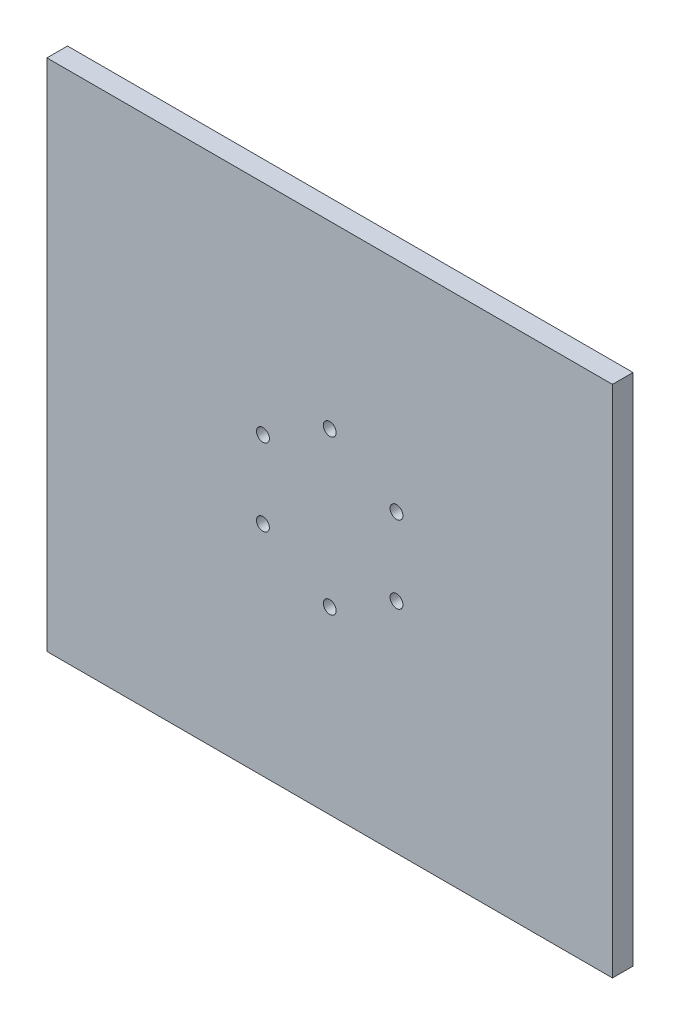
ISO-10303-21;
HEADER;
FILE_DESCRIPTION(('STEP AP214'),'2;1');
FILE_NAME('part.step','',(''),(''),'','','');
FILE_SCHEMA(('AUTOMOTIVE_DESIGN { 1 0 10303 214 1 1 1 1 }'));
ENDSEC;
DATA;
#1=APPLICATION_CONTEXT('core data for automotive mechanical design processes');
#2=APPLICATION_PROTOCOL_DEFINITION('international standard','automotive_design',2000,#1);
#3=PRODUCT_CONTEXT('',#1,'mechanical');
#4=PRODUCT('Part','Part','',(#3));
#5=PRODUCT_RELATED_PRODUCT_CATEGORY('part','',(#4));
#6=PRODUCT_DEFINITION_FORMATION('','',#4);
#7=PRODUCT_DEFINITION_CONTEXT('part definition',#1,'design');
#8=PRODUCT_DEFINITION('design','',#6,#7);
#9=PRODUCT_DEFINITION_SHAPE('','',#8);
#10=(LENGTH_UNIT() NAMED_UNIT(*) SI_UNIT(.MILLI.,.METRE.));
#11=(NAMED_UNIT(*) PLANE_ANGLE_UNIT() SI_UNIT($,.RADIAN.));
#12=(NAMED_UNIT(*) SI_UNIT($,.STERADIAN.) SOLID_ANGLE_UNIT());
#13=UNCERTAINTY_MEASURE_WITH_UNIT(LENGTH_MEASURE(1.E-05),#10,'distance_accuracy_value','');
#14=(GEOMETRIC_REPRESENTATION_CONTEXT(3) GLOBAL_UNCERTAINTY_ASSIGNED_CONTEXT((#13)) GLOBAL_UNIT_ASSIGNED_CONTEXT((#10,
#11,#12)) REPRESENTATION_CONTEXT('',''));
#15=CARTESIAN_POINT('',(0.,0.,0.));
#16=DIRECTION('',(0.,0.,1.));
#17=DIRECTION('',(1.,0.,0.));
#18=AXIS2_PLACEMENT_3D('',#15,#16,#17);
#19=CARTESIAN_POINT('',(0.,0.,8.));
#20=DIRECTION('',(1.,0.,0.));
#21=DIRECTION('',(0.,1.,0.));
#22=AXIS2_PLACEMENT_3D('',#19,#20,#21);
#23=PLANE('',#22);
#24=DIRECTION('',(0.,-1.,0.));
#25=VECTOR('',#24,1.);
#26=CARTESIAN_POINT('',(0.,0.,0.));
#27=LINE('',#26,#25);
#28=CARTESIAN_POINT('',(0.,0.,0.));
#29=VERTEX_POINT('',#28);
#30=CARTESIAN_POINT('',(0.,-200.,0.));
#31=VERTEX_POINT('',#30);
#32=EDGE_CURVE('E100',#29,#31,#27,.T.);
#33=ORIENTED_EDGE('',*,*,#32,.T.);
#34=DIRECTION('',(0.,0.,-1.));
#35=VECTOR('',#34,1.);
#36=CARTESIAN_POINT('',(0.,-200.,8.));
#37=LINE('',#36,#35);
#38=CARTESIAN_POINT('',(0.,-200.,8.));
#39=VERTEX_POINT('',#38);
#40=EDGE_CURVE('E11',#39,#31,#37,.T.);
#41=ORIENTED_EDGE('',*,*,#40,.F.);
#42=DIRECTION('',(0.,-1.,0.));
#43=VECTOR('',#42,1.);
#44=CARTESIAN_POINT('',(0.,0.,8.));
#45=LINE('',#44,#43);
#46=CARTESIAN_POINT('',(0.,0.,8.));
#47=VERTEX_POINT('',#46);
#48=EDGE_CURVE('E88',#47,#39,#45,.T.);
#49=ORIENTED_EDGE('',*,*,#48,.F.);
#50=DIRECTION('',(0.,0.,-1.));
#51=VECTOR('',#50,1.);
#52=CARTESIAN_POINT('',(0.,0.,8.));
#53=LINE('',#52,#51);
#54=EDGE_CURVE('E96',#47,#29,#53,.T.);
#55=ORIENTED_EDGE('',*,*,#54,.T.);
#56=EDGE_LOOP('',(#33,#41,#49,#55));
#57=FACE_BOUND('',#56,.T.);
#58=ADVANCED_FACE('F37',(#57),#23,.F.);
#59=CARTESIAN_POINT('',(0.,-200.,8.));
#60=DIRECTION('',(0.,1.,0.));
#61=DIRECTION('',(0.,0.,1.));
#62=AXIS2_PLACEMENT_3D('',#59,#60,#61);
#63=PLANE('',#62);
#64=DIRECTION('',(1.,0.,0.));
#65=VECTOR('',#64,1.);
#66=CARTESIAN_POINT('',(0.,-200.,0.));
#67=LINE('',#66,#65);
#68=CARTESIAN_POINT('',(220.,-200.,0.));
#69=VERTEX_POINT('',#68);
#70=EDGE_CURVE('E92',#31,#69,#67,.T.);
#71=ORIENTED_EDGE('',*,*,#70,.T.);
#72=DIRECTION('',(0.,0.,-1.));
#73=VECTOR('',#72,1.);
#74=CARTESIAN_POINT('',(220.,-200.,8.));
#75=LINE('',#74,#73);
#76=CARTESIAN_POINT('',(220.,-200.,8.));
#77=VERTEX_POINT('',#76);
#78=EDGE_CURVE('E45',#77,#69,#75,.T.);
#79=ORIENTED_EDGE('',*,*,#78,.F.);
#80=DIRECTION('',(1.,0.,0.));
#81=VECTOR('',#80,1.);
#82=CARTESIAN_POINT('',(0.,-200.,8.));
#83=LINE('',#82,#81);
#84=EDGE_CURVE('E83',#39,#77,#83,.T.);
#85=ORIENTED_EDGE('',*,*,#84,.F.);
#86=ORIENTED_EDGE('',*,*,#40,.T.);
#87=EDGE_LOOP('',(#71,#79,#85,#86));
#88=FACE_BOUND('',#87,.T.);
#89=ADVANCED_FACE('F91',(#88),#63,.F.);
#90=CARTESIAN_POINT('',(220.,0.,8.));
#91=DIRECTION('',(-1.,0.,0.));
#92=DIRECTION('',(0.,-1.,0.));
#93=AXIS2_PLACEMENT_3D('',#90,#91,#92);
#94=PLANE('',#93);
#95=DIRECTION('',(0.,1.,0.));
#96=VECTOR('',#95,1.);
#97=CARTESIAN_POINT('',(220.,0.,0.));
#98=LINE('',#97,#96);
#99=CARTESIAN_POINT('',(220.,0.,0.));
#100=VERTEX_POINT('',#99);
#101=EDGE_CURVE('E70',#69,#100,#98,.T.);
#102=ORIENTED_EDGE('',*,*,#101,.T.);
#103=DIRECTION('',(0.,0.,-1.));
#104=VECTOR('',#103,1.);
#105=CARTESIAN_POINT('',(220.,0.,8.));
#106=LINE('',#105,#104);
#107=CARTESIAN_POINT('',(220.,0.,8.));
#108=VERTEX_POINT('',#107);
#109=EDGE_CURVE('E93',#108,#100,#106,.T.);
#110=ORIENTED_EDGE('',*,*,#109,.F.);
#111=DIRECTION('',(0.,1.,0.));
#112=VECTOR('',#111,1.);
#113=CARTESIAN_POINT('',(220.,0.,8.));
#114=LINE('',#113,#112);
#115=EDGE_CURVE('E86',#77,#108,#114,.T.);
#116=ORIENTED_EDGE('',*,*,#115,.F.);
#117=ORIENTED_EDGE('',*,*,#78,.T.);
#118=EDGE_LOOP('',(#102,#110,#116,#117));
#119=FACE_BOUND('',#118,.T.);
#120=ADVANCED_FACE('F94',(#119),#94,.F.);
#121=CARTESIAN_POINT('',(0.,0.,8.));
#122=DIRECTION('',(0.,-1.,0.));
#123=DIRECTION('',(0.,0.,-1.));
#124=AXIS2_PLACEMENT_3D('',#121,#122,#123);
#125=PLANE('',#124);
#126=DIRECTION('',(-1.,0.,0.));
#127=VECTOR('',#126,1.);
#128=CARTESIAN_POINT('',(0.,0.,0.));
#129=LINE('',#128,#127);
#130=EDGE_CURVE('E76',#100,#29,#129,.T.);
#131=ORIENTED_EDGE('',*,*,#130,.T.);
#132=ORIENTED_EDGE('',*,*,#54,.F.);
#133=DIRECTION('',(-1.,0.,0.));
#134=VECTOR('',#133,1.);
#135=CARTESIAN_POINT('',(0.,0.,8.));
#136=LINE('',#135,#134);
#137=EDGE_CURVE('E53',#108,#47,#136,.T.);
#138=ORIENTED_EDGE('',*,*,#137,.F.);
#139=ORIENTED_EDGE('',*,*,#109,.T.);
#140=EDGE_LOOP('',(#131,#132,#138,#139));
#141=FACE_BOUND('',#140,.T.);
#142=ADVANCED_FACE('F108',(#141),#125,.F.);
#143=CARTESIAN_POINT('',(0.,0.,8.));
#144=DIRECTION('',(0.,0.,1.));
#145=DIRECTION('',(1.,0.,0.));
#146=AXIS2_PLACEMENT_3D('',#143,#144,#145);
#147=PLANE('',#146);
#148=CARTESIAN_POINT('',(110.,-70.,8.));
#149=DIRECTION('',(0.,0.,1.));
#150=DIRECTION('',(1.,0.,0.));
#151=AXIS2_PLACEMENT_3D('',#148,#149,#150);
#152=CIRCLE('',#151,2.5);
#153=CARTESIAN_POINT('',(112.5,-70.,8.));
#154=VERTEX_POINT('',#153);
#155=EDGE_CURVE('E139',#154,#154,#152,.T.);
#156=ORIENTED_EDGE('',*,*,#155,.F.);
#157=EDGE_LOOP('',(#156));
#158=FACE_BOUND('',#157,.T.);
#159=CARTESIAN_POINT('',(84.0192378864672,-85.,8.));
#160=DIRECTION('',(0.,0.,1.));
#161=DIRECTION('',(1.,0.,0.));
#162=AXIS2_PLACEMENT_3D('',#159,#160,#161);
#163=CIRCLE('',#162,2.49999999999999);
#164=CARTESIAN_POINT('',(86.5192378864672,-85.,8.));
#165=VERTEX_POINT('',#164);
#166=EDGE_CURVE('E140',#165,#165,#163,.T.);
#167=ORIENTED_EDGE('',*,*,#166,.F.);
#168=EDGE_LOOP('',(#167));
#169=FACE_BOUND('',#168,.T.);
#170=CARTESIAN_POINT('',(84.0192378864673,-115.,8.));
#171=DIRECTION('',(0.,0.,1.));
#172=DIRECTION('',(1.,0.,0.));
#173=AXIS2_PLACEMENT_3D('',#170,#171,#172);
#174=CIRCLE('',#173,2.49999999999999);
#175=CARTESIAN_POINT('',(86.5192378864673,-115.,8.));
#176=VERTEX_POINT('',#175);
#177=EDGE_CURVE('E114',#176,#176,#174,.T.);
#178=ORIENTED_EDGE('',*,*,#177,.F.);
#179=EDGE_LOOP('',(#178));
#180=FACE_BOUND('',#179,.T.);
#181=CARTESIAN_POINT('',(110.000000000001,-130.,8.));
#182=DIRECTION('',(0.,0.,1.));
#183=DIRECTION('',(1.,0.,0.));
#184=AXIS2_PLACEMENT_3D('',#181,#182,#183);
#185=CIRCLE('',#184,2.5);
#186=CARTESIAN_POINT('',(112.500000000001,-130.,8.));
#187=VERTEX_POINT('',#186);
#188=EDGE_CURVE('E121',#187,#187,#185,.T.);
#189=ORIENTED_EDGE('',*,*,#188,.F.);
#190=EDGE_LOOP('',(#189));
#191=FACE_BOUND('',#190,.T.);
#192=CARTESIAN_POINT('',(135.980762113534,-115.,8.));
#193=DIRECTION('',(0.,0.,1.));
#194=DIRECTION('',(1.,0.,0.));
#195=AXIS2_PLACEMENT_3D('',#192,#193,#194);
#196=CIRCLE('',#195,2.49999999999999);
#197=CARTESIAN_POINT('',(138.480762113534,-115.,8.));
#198=VERTEX_POINT('',#197);
#199=EDGE_CURVE('E127',#198,#198,#196,.T.);
#200=ORIENTED_EDGE('',*,*,#199,.F.);
#201=EDGE_LOOP('',(#200));
#202=FACE_BOUND('',#201,.T.);
#203=CARTESIAN_POINT('',(135.980762113533,-84.9999999999997,8.));
#204=DIRECTION('',(0.,0.,1.));
#205=DIRECTION('',(1.,0.,0.));
#206=AXIS2_PLACEMENT_3D('',#203,#204,#205);
#207=CIRCLE('',#206,2.5);
#208=CARTESIAN_POINT('',(138.480762113533,-84.9999999999997,8.));
#209=VERTEX_POINT('',#208);
#210=EDGE_CURVE('E133',#209,#209,#207,.T.);
#211=ORIENTED_EDGE('',*,*,#210,.F.);
#212=EDGE_LOOP('',(#211));
#213=FACE_BOUND('',#212,.T.);
#214=ORIENTED_EDGE('',*,*,#48,.T.);
#215=ORIENTED_EDGE('',*,*,#84,.T.);
#216=ORIENTED_EDGE('',*,*,#115,.T.);
#217=ORIENTED_EDGE('',*,*,#137,.T.);
#218=EDGE_LOOP('',(#214,#215,#216,#217));
#219=FACE_BOUND('',#218,.T.);
#220=ADVANCED_FACE('F84',(#158,#169,#180,#191,#202,#213,#219),#147,.T.);
#221=CARTESIAN_POINT('',(0.,0.,0.));
#222=DIRECTION('',(0.,0.,1.));
#223=DIRECTION('',(1.,0.,0.));
#224=AXIS2_PLACEMENT_3D('',#221,#222,#223);
#225=PLANE('',#224);
#226=CARTESIAN_POINT('',(110.,-70.,0.));
#227=DIRECTION('',(0.,0.,1.));
#228=DIRECTION('',(1.,0.,0.));
#229=AXIS2_PLACEMENT_3D('',#226,#227,#228);
#230=CIRCLE('',#229,2.5);
#231=CARTESIAN_POINT('',(112.5,-70.,0.));
#232=VERTEX_POINT('',#231);
#233=EDGE_CURVE('E103',#232,#232,#230,.T.);
#234=ORIENTED_EDGE('',*,*,#233,.T.);
#235=EDGE_LOOP('',(#234));
#236=FACE_BOUND('',#235,.T.);
#237=CARTESIAN_POINT('',(84.0192378864672,-85.,0.));
#238=DIRECTION('',(0.,0.,1.));
#239=DIRECTION('',(1.,0.,0.));
#240=AXIS2_PLACEMENT_3D('',#237,#238,#239);
#241=CIRCLE('',#240,2.49999999999999);
#242=CARTESIAN_POINT('',(86.5192378864672,-85.,0.));
#243=VERTEX_POINT('',#242);
#244=EDGE_CURVE('E118',#243,#243,#241,.T.);
#245=ORIENTED_EDGE('',*,*,#244,.T.);
#246=EDGE_LOOP('',(#245));
#247=FACE_BOUND('',#246,.T.);
#248=CARTESIAN_POINT('',(84.0192378864673,-115.,0.));
#249=DIRECTION('',(0.,0.,1.));
#250=DIRECTION('',(1.,0.,0.));
#251=AXIS2_PLACEMENT_3D('',#248,#249,#250);
#252=CIRCLE('',#251,2.49999999999999);
#253=CARTESIAN_POINT('',(86.5192378864673,-115.,0.));
#254=VERTEX_POINT('',#253);
#255=EDGE_CURVE('E117',#254,#254,#252,.T.);
#256=ORIENTED_EDGE('',*,*,#255,.T.);
#257=EDGE_LOOP('',(#256));
#258=FACE_BOUND('',#257,.T.);
#259=CARTESIAN_POINT('',(110.000000000001,-130.,0.));
#260=DIRECTION('',(0.,0.,1.));
#261=DIRECTION('',(1.,0.,0.));
#262=AXIS2_PLACEMENT_3D('',#259,#260,#261);
#263=CIRCLE('',#262,2.5);
#264=CARTESIAN_POINT('',(112.500000000001,-130.,0.));
#265=VERTEX_POINT('',#264);
#266=EDGE_CURVE('E124',#265,#265,#263,.T.);
#267=ORIENTED_EDGE('',*,*,#266,.T.);
#268=EDGE_LOOP('',(#267));
#269=FACE_BOUND('',#268,.T.);
#270=CARTESIAN_POINT('',(135.980762113534,-115.,0.));
#271=DIRECTION('',(0.,0.,1.));
#272=DIRECTION('',(1.,0.,0.));
#273=AXIS2_PLACEMENT_3D('',#270,#271,#272);
#274=CIRCLE('',#273,2.49999999999999);
#275=CARTESIAN_POINT('',(138.480762113534,-115.,0.));
#276=VERTEX_POINT('',#275);
#277=EDGE_CURVE('E130',#276,#276,#274,.T.);
#278=ORIENTED_EDGE('',*,*,#277,.T.);
#279=EDGE_LOOP('',(#278));
#280=FACE_BOUND('',#279,.T.);
#281=CARTESIAN_POINT('',(135.980762113533,-84.9999999999997,0.));
#282=DIRECTION('',(0.,0.,1.));
#283=DIRECTION('',(1.,0.,0.));
#284=AXIS2_PLACEMENT_3D('',#281,#282,#283);
#285=CIRCLE('',#284,2.5);
#286=CARTESIAN_POINT('',(138.480762113533,-84.9999999999997,0.));
#287=VERTEX_POINT('',#286);
#288=EDGE_CURVE('E136',#287,#287,#285,.T.);
#289=ORIENTED_EDGE('',*,*,#288,.T.);
#290=EDGE_LOOP('',(#289));
#291=FACE_BOUND('',#290,.T.);
#292=ORIENTED_EDGE('',*,*,#32,.F.);
#293=ORIENTED_EDGE('',*,*,#130,.F.);
#294=ORIENTED_EDGE('',*,*,#101,.F.);
#295=ORIENTED_EDGE('',*,*,#70,.F.);
#296=EDGE_LOOP('',(#292,#293,#294,#295));
#297=FACE_BOUND('',#296,.T.);
#298=ADVANCED_FACE('F111',(#236,#247,#258,#269,#280,#291,#297),#225,.F.);
#299=CARTESIAN_POINT('',(135.980762113533,-84.9999999999997,0.));
#300=DIRECTION('',(0.,0.,1.));
#301=DIRECTION('',(1.,0.,0.));
#302=AXIS2_PLACEMENT_3D('',#299,#300,#301);
#303=CYLINDRICAL_SURFACE('',#302,2.5);
#304=ORIENTED_EDGE('',*,*,#288,.F.);
#305=EDGE_LOOP('',(#304));
#306=FACE_BOUND('',#305,.T.);
#307=ORIENTED_EDGE('',*,*,#210,.T.);
#308=EDGE_LOOP('',(#307));
#309=FACE_BOUND('',#308,.T.);
#310=ADVANCED_FACE('F172',(#306,#309),#303,.F.);
#311=CARTESIAN_POINT('',(135.980762113534,-115.,0.));
#312=DIRECTION('',(0.,0.,1.));
#313=DIRECTION('',(1.,0.,0.));
#314=AXIS2_PLACEMENT_3D('',#311,#312,#313);
#315=CYLINDRICAL_SURFACE('',#314,2.49999999999999);
#316=ORIENTED_EDGE('',*,*,#277,.F.);
#317=EDGE_LOOP('',(#316));
#318=FACE_BOUND('',#317,.T.);
#319=ORIENTED_EDGE('',*,*,#199,.T.);
#320=EDGE_LOOP('',(#319));
#321=FACE_BOUND('',#320,.T.);
#322=ADVANCED_FACE('F174',(#318,#321),#315,.F.);
#323=CARTESIAN_POINT('',(110.000000000001,-130.,0.));
#324=DIRECTION('',(0.,0.,1.));
#325=DIRECTION('',(1.,0.,0.));
#326=AXIS2_PLACEMENT_3D('',#323,#324,#325);
#327=CYLINDRICAL_SURFACE('',#326,2.5);
#328=ORIENTED_EDGE('',*,*,#266,.F.);
#329=EDGE_LOOP('',(#328));
#330=FACE_BOUND('',#329,.T.);
#331=ORIENTED_EDGE('',*,*,#188,.T.);
#332=EDGE_LOOP('',(#331));
#333=FACE_BOUND('',#332,.T.);
#334=ADVANCED_FACE('F181',(#330,#333),#327,.F.);
#335=CARTESIAN_POINT('',(84.0192378864673,-115.,0.));
#336=DIRECTION('',(0.,0.,1.));
#337=DIRECTION('',(1.,0.,0.));
#338=AXIS2_PLACEMENT_3D('',#335,#336,#337);
#339=CYLINDRICAL_SURFACE('',#338,2.49999999999999);
#340=ORIENTED_EDGE('',*,*,#255,.F.);
#341=EDGE_LOOP('',(#340));
#342=FACE_BOUND('',#341,.T.);
#343=ORIENTED_EDGE('',*,*,#177,.T.);
#344=EDGE_LOOP('',(#343));
#345=FACE_BOUND('',#344,.T.);
#346=ADVANCED_FACE('F199',(#342,#345),#339,.F.);
#347=CARTESIAN_POINT('',(84.0192378864672,-85.,0.));
#348=DIRECTION('',(0.,0.,1.));
#349=DIRECTION('',(1.,0.,0.));
#350=AXIS2_PLACEMENT_3D('',#347,#348,#349);
#351=CYLINDRICAL_SURFACE('',#350,2.49999999999999);
#352=ORIENTED_EDGE('',*,*,#244,.F.);
#353=EDGE_LOOP('',(#352));
#354=FACE_BOUND('',#353,.T.);
#355=ORIENTED_EDGE('',*,*,#166,.T.);
#356=EDGE_LOOP('',(#355));
#357=FACE_BOUND('',#356,.T.);
#358=ADVANCED_FACE('F155',(#354,#357),#351,.F.);
#359=CARTESIAN_POINT('',(110.,-70.,0.));
#360=DIRECTION('',(0.,0.,1.));
#361=DIRECTION('',(1.,0.,0.));
#362=AXIS2_PLACEMENT_3D('',#359,#360,#361);
#363=CYLINDRICAL_SURFACE('',#362,2.5);
#364=ORIENTED_EDGE('',*,*,#233,.F.);
#365=EDGE_LOOP('',(#364));
#366=FACE_BOUND('',#365,.T.);
#367=ORIENTED_EDGE('',*,*,#155,.T.);
#368=EDGE_LOOP('',(#367));
#369=FACE_BOUND('',#368,.T.);
#370=ADVANCED_FACE('F152',(#366,#369),#363,.F.);
#371=CLOSED_SHELL('',(#58,#89,#120,#142,#220,#298,#310,#322,#334,#346,#358,#370));
#372=MANIFOLD_SOLID_BREP('B2',#371);
#373=ADVANCED_BREP_SHAPE_REPRESENTATION('',(#18,#372),#14);
#374=SHAPE_DEFINITION_REPRESENTATION(#9,#373);
ENDSEC;
END-ISO-10303-21;
